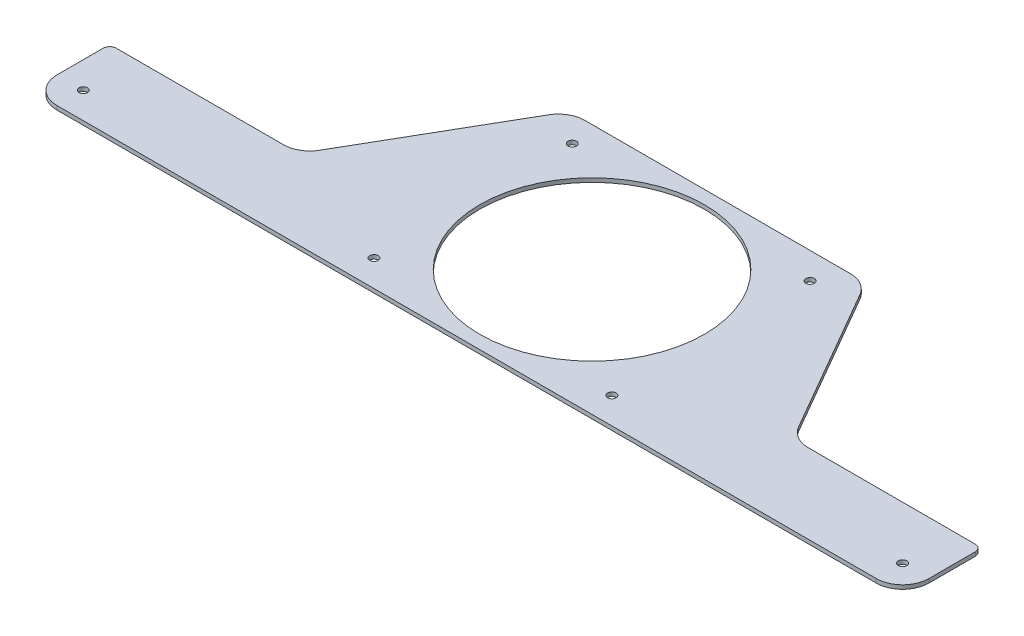
ISO-10303-21;
HEADER;
FILE_DESCRIPTION(('STEP AP214'),'2;1');
FILE_NAME('part.step','',(''),(''),'','','');
FILE_SCHEMA(('AUTOMOTIVE_DESIGN { 1 0 10303 214 1 1 1 1 }'));
ENDSEC;
DATA;
#1=APPLICATION_CONTEXT('core data for automotive mechanical design processes');
#2=APPLICATION_PROTOCOL_DEFINITION('international standard','automotive_design',2000,#1);
#3=PRODUCT_CONTEXT('',#1,'mechanical');
#4=PRODUCT('Part','Part','',(#3));
#5=PRODUCT_RELATED_PRODUCT_CATEGORY('part','',(#4));
#6=PRODUCT_DEFINITION_FORMATION('','',#4);
#7=PRODUCT_DEFINITION_CONTEXT('part definition',#1,'design');
#8=PRODUCT_DEFINITION('design','',#6,#7);
#9=PRODUCT_DEFINITION_SHAPE('','',#8);
#10=(LENGTH_UNIT() NAMED_UNIT(*) SI_UNIT(.MILLI.,.METRE.));
#11=(NAMED_UNIT(*) PLANE_ANGLE_UNIT() SI_UNIT($,.RADIAN.));
#12=(NAMED_UNIT(*) SI_UNIT($,.STERADIAN.) SOLID_ANGLE_UNIT());
#13=UNCERTAINTY_MEASURE_WITH_UNIT(LENGTH_MEASURE(1.E-05),#10,'distance_accuracy_value','');
#14=(GEOMETRIC_REPRESENTATION_CONTEXT(3) GLOBAL_UNCERTAINTY_ASSIGNED_CONTEXT((#13)) GLOBAL_UNIT_ASSIGNED_CONTEXT((#10,
#11,#12)) REPRESENTATION_CONTEXT('',''));
#15=CARTESIAN_POINT('',(0.,0.,0.));
#16=DIRECTION('',(0.,0.,1.));
#17=DIRECTION('',(1.,0.,0.));
#18=AXIS2_PLACEMENT_3D('',#15,#16,#17);
#19=CARTESIAN_POINT('',(0.,1.5,0.));
#20=DIRECTION('',(0.,-1.,0.));
#21=DIRECTION('',(0.,0.,-1.));
#22=AXIS2_PLACEMENT_3D('',#19,#20,#21);
#23=PLANE('',#22);
#24=CARTESIAN_POINT('',(-155.,1.5,37.5));
#25=DIRECTION('',(0.,1.,0.));
#26=DIRECTION('',(0.,0.,1.));
#27=AXIS2_PLACEMENT_3D('',#24,#25,#26);
#28=CIRCLE('',#27,1.59999999999999);
#29=CARTESIAN_POINT('',(-155.,1.5,39.1));
#30=VERTEX_POINT('',#29);
#31=EDGE_CURVE('E467',#30,#30,#28,.T.);
#32=ORIENTED_EDGE('',*,*,#31,.F.);
#33=EDGE_LOOP('',(#32));
#34=FACE_BOUND('',#33,.T.);
#35=CARTESIAN_POINT('',(-45.,1.5,37.5));
#36=DIRECTION('',(0.,1.,0.));
#37=DIRECTION('',(0.,0.,1.));
#38=AXIS2_PLACEMENT_3D('',#35,#36,#37);
#39=CIRCLE('',#38,1.6);
#40=CARTESIAN_POINT('',(-45.,1.5,39.1));
#41=VERTEX_POINT('',#40);
#42=EDGE_CURVE('E473',#41,#41,#39,.T.);
#43=ORIENTED_EDGE('',*,*,#42,.F.);
#44=EDGE_LOOP('',(#43));
#45=FACE_BOUND('',#44,.T.);
#46=CARTESIAN_POINT('',(-45.,1.5,-37.5));
#47=DIRECTION('',(0.,1.,0.));
#48=DIRECTION('',(0.,0.,1.));
#49=AXIS2_PLACEMENT_3D('',#46,#47,#48);
#50=CIRCLE('',#49,1.6);
#51=CARTESIAN_POINT('',(-45.,1.5,-35.9));
#52=VERTEX_POINT('',#51);
#53=EDGE_CURVE('E481',#52,#52,#50,.T.);
#54=ORIENTED_EDGE('',*,*,#53,.F.);
#55=EDGE_LOOP('',(#54));
#56=FACE_BOUND('',#55,.T.);
#57=CARTESIAN_POINT('',(45.,1.5,37.5));
#58=DIRECTION('',(0.,1.,0.));
#59=DIRECTION('',(0.,0.,-1.));
#60=AXIS2_PLACEMENT_3D('',#57,#58,#59);
#61=CIRCLE('',#60,1.6);
#62=CARTESIAN_POINT('',(45.,1.5,35.9));
#63=VERTEX_POINT('',#62);
#64=EDGE_CURVE('E487',#63,#63,#61,.T.);
#65=ORIENTED_EDGE('',*,*,#64,.F.);
#66=EDGE_LOOP('',(#65));
#67=FACE_BOUND('',#66,.T.);
#68=CARTESIAN_POINT('',(45.,1.5,-37.5));
#69=DIRECTION('',(0.,1.,0.));
#70=DIRECTION('',(0.,0.,-1.));
#71=AXIS2_PLACEMENT_3D('',#68,#69,#70);
#72=CIRCLE('',#71,1.6);
#73=CARTESIAN_POINT('',(45.,1.5,-39.1));
#74=VERTEX_POINT('',#73);
#75=EDGE_CURVE('E493',#74,#74,#72,.T.);
#76=ORIENTED_EDGE('',*,*,#75,.F.);
#77=EDGE_LOOP('',(#76));
#78=FACE_BOUND('',#77,.T.);
#79=CARTESIAN_POINT('',(155.,1.5,37.5));
#80=DIRECTION('',(0.,1.,0.));
#81=DIRECTION('',(0.,0.,-1.));
#82=AXIS2_PLACEMENT_3D('',#79,#80,#81);
#83=CIRCLE('',#82,1.59999999999999);
#84=CARTESIAN_POINT('',(155.,1.5,35.9));
#85=VERTEX_POINT('',#84);
#86=EDGE_CURVE('E499',#85,#85,#83,.T.);
#87=ORIENTED_EDGE('',*,*,#86,.F.);
#88=EDGE_LOOP('',(#87));
#89=FACE_BOUND('',#88,.T.);
#90=DIRECTION('',(-1.,0.,0.));
#91=VECTOR('',#90,1.);
#92=CARTESIAN_POINT('',(-93.5277674973255,1.5,17.5));
#93=LINE('',#92,#91);
#94=CARTESIAN_POINT('',(-99.3012701892218,1.5,17.5));
#95=VERTEX_POINT('',#94);
#96=CARTESIAN_POINT('',(-162.5,1.5,17.5000000000001));
#97=VERTEX_POINT('',#96);
#98=EDGE_CURVE('E270',#95,#97,#93,.T.);
#99=ORIENTED_EDGE('',*,*,#98,.T.);
#100=CARTESIAN_POINT('',(-162.5,1.5,20.0000000000001));
#101=DIRECTION('',(0.,-1.,0.));
#102=DIRECTION('',(0.,0.,-1.));
#103=AXIS2_PLACEMENT_3D('',#100,#101,#102);
#104=CIRCLE('',#103,2.5);
#105=CARTESIAN_POINT('',(-165.,1.5,20.0000000000001));
#106=VERTEX_POINT('',#105);
#107=EDGE_CURVE('E220',#97,#106,#104,.F.);
#108=ORIENTED_EDGE('',*,*,#107,.T.);
#109=DIRECTION('',(0.,0.,1.));
#110=VECTOR('',#109,1.);
#111=CARTESIAN_POINT('',(-165.,1.5,17.5000000000001));
#112=LINE('',#111,#110);
#113=CARTESIAN_POINT('',(-165.,1.5,37.5));
#114=VERTEX_POINT('',#113);
#115=EDGE_CURVE('E170',#106,#114,#112,.T.);
#116=ORIENTED_EDGE('',*,*,#115,.T.);
#117=CARTESIAN_POINT('',(-155.,1.5,37.5));
#118=DIRECTION('',(0.,-1.,0.));
#119=DIRECTION('',(0.,0.,-1.));
#120=AXIS2_PLACEMENT_3D('',#117,#118,#119);
#121=CIRCLE('',#120,10.);
#122=CARTESIAN_POINT('',(-155.,1.5,47.5));
#123=VERTEX_POINT('',#122);
#124=EDGE_CURVE('E211',#114,#123,#121,.F.);
#125=ORIENTED_EDGE('',*,*,#124,.T.);
#126=DIRECTION('',(1.,0.,0.));
#127=VECTOR('',#126,1.);
#128=CARTESIAN_POINT('',(-165.,1.5,47.5));
#129=LINE('',#128,#127);
#130=CARTESIAN_POINT('',(155.,1.5,47.4999999999999));
#131=VERTEX_POINT('',#130);
#132=EDGE_CURVE('E274',#123,#131,#129,.T.);
#133=ORIENTED_EDGE('',*,*,#132,.T.);
#134=CARTESIAN_POINT('',(155.,1.5,37.4999999999999));
#135=DIRECTION('',(0.,-1.,0.));
#136=DIRECTION('',(0.,0.,-1.));
#137=AXIS2_PLACEMENT_3D('',#134,#135,#136);
#138=CIRCLE('',#137,10.);
#139=CARTESIAN_POINT('',(165.,1.5,37.4999999999999));
#140=VERTEX_POINT('',#139);
#141=EDGE_CURVE('E213',#131,#140,#138,.F.);
#142=ORIENTED_EDGE('',*,*,#141,.T.);
#143=DIRECTION('',(0.,0.,-1.));
#144=VECTOR('',#143,1.);
#145=CARTESIAN_POINT('',(165.,1.5,17.5));
#146=LINE('',#145,#144);
#147=CARTESIAN_POINT('',(165.,1.5,20.));
#148=VERTEX_POINT('',#147);
#149=EDGE_CURVE('E281',#140,#148,#146,.T.);
#150=ORIENTED_EDGE('',*,*,#149,.T.);
#151=CARTESIAN_POINT('',(162.5,1.5,20.));
#152=DIRECTION('',(0.,-1.,0.));
#153=DIRECTION('',(0.,0.,-1.));
#154=AXIS2_PLACEMENT_3D('',#151,#152,#153);
#155=CIRCLE('',#154,2.5);
#156=CARTESIAN_POINT('',(162.5,1.5,17.5));
#157=VERTEX_POINT('',#156);
#158=EDGE_CURVE('E218',#148,#157,#155,.F.);
#159=ORIENTED_EDGE('',*,*,#158,.T.);
#160=DIRECTION('',(-1.,0.,0.));
#161=VECTOR('',#160,1.);
#162=CARTESIAN_POINT('',(93.5277674973255,1.5,17.5));
#163=LINE('',#162,#161);
#164=CARTESIAN_POINT('',(99.3012701892218,1.5,17.5));
#165=VERTEX_POINT('',#164);
#166=EDGE_CURVE('E284',#157,#165,#163,.T.);
#167=ORIENTED_EDGE('',*,*,#166,.T.);
#168=CARTESIAN_POINT('',(99.3012701892218,1.5,7.50000000000001));
#169=DIRECTION('',(0.,-1.,0.));
#170=DIRECTION('',(0.,0.,-1.));
#171=AXIS2_PLACEMENT_3D('',#168,#169,#170);
#172=CIRCLE('',#171,10.);
#173=CARTESIAN_POINT('',(90.6410161513773,1.5,12.5));
#174=VERTEX_POINT('',#173);
#175=EDGE_CURVE('E253',#165,#174,#172,.T.);
#176=ORIENTED_EDGE('',*,*,#175,.T.);
#177=DIRECTION('',(-0.499999999999998,0.,-0.86602540378444));
#178=VECTOR('',#177,1.);
#179=CARTESIAN_POINT('',(56.,1.5,-47.5));
#180=LINE('',#179,#178);
#181=CARTESIAN_POINT('',(58.8867513459481,1.5,-42.5));
#182=VERTEX_POINT('',#181);
#183=EDGE_CURVE('E287',#174,#182,#180,.T.);
#184=ORIENTED_EDGE('',*,*,#183,.T.);
#185=CARTESIAN_POINT('',(50.2264973081037,1.5,-37.5));
#186=DIRECTION('',(0.,-1.,0.));
#187=DIRECTION('',(0.,0.,-1.));
#188=AXIS2_PLACEMENT_3D('',#185,#186,#187);
#189=CIRCLE('',#188,10.);
#190=CARTESIAN_POINT('',(50.2264973081037,1.5,-47.5));
#191=VERTEX_POINT('',#190);
#192=EDGE_CURVE('E58',#182,#191,#189,.F.);
#193=ORIENTED_EDGE('',*,*,#192,.T.);
#194=DIRECTION('',(-1.,0.,0.));
#195=VECTOR('',#194,1.);
#196=CARTESIAN_POINT('',(56.,1.5,-47.5));
#197=LINE('',#196,#195);
#198=CARTESIAN_POINT('',(-50.2264973081037,1.5,-47.4999999999999));
#199=VERTEX_POINT('',#198);
#200=EDGE_CURVE('E198',#191,#199,#197,.T.);
#201=ORIENTED_EDGE('',*,*,#200,.T.);
#202=CARTESIAN_POINT('',(-50.2264973081037,1.5,-37.4999999999999));
#203=DIRECTION('',(0.,-1.,0.));
#204=DIRECTION('',(0.,0.,-1.));
#205=AXIS2_PLACEMENT_3D('',#202,#203,#204);
#206=CIRCLE('',#205,10.);
#207=CARTESIAN_POINT('',(-58.8867513459481,1.5,-42.4999999999999));
#208=VERTEX_POINT('',#207);
#209=EDGE_CURVE('E215',#199,#208,#206,.F.);
#210=ORIENTED_EDGE('',*,*,#209,.T.);
#211=DIRECTION('',(-0.499999999999998,0.,0.86602540378444));
#212=VECTOR('',#211,1.);
#213=CARTESIAN_POINT('',(-56.,1.5,-47.4999999999999));
#214=LINE('',#213,#212);
#215=CARTESIAN_POINT('',(-90.6410161513773,1.5,12.5));
#216=VERTEX_POINT('',#215);
#217=EDGE_CURVE('E197',#208,#216,#214,.T.);
#218=ORIENTED_EDGE('',*,*,#217,.T.);
#219=CARTESIAN_POINT('',(-99.3012701892218,1.5,7.50000000000005));
#220=DIRECTION('',(0.,-1.,0.));
#221=DIRECTION('',(0.,0.,-1.));
#222=AXIS2_PLACEMENT_3D('',#219,#220,#221);
#223=CIRCLE('',#222,10.);
#224=EDGE_CURVE('E12',#216,#95,#223,.T.);
#225=ORIENTED_EDGE('',*,*,#224,.T.);
#226=EDGE_LOOP('',(#99,#108,#116,#125,#133,#142,#150,#159,#167,#176,#184,#193,#201,#210,#218,#225));
#227=FACE_BOUND('',#226,.T.);
#228=CARTESIAN_POINT('',(0.,1.5,0.));
#229=DIRECTION('',(0.,1.,0.));
#230=DIRECTION('',(0.,0.,1.));
#231=AXIS2_PLACEMENT_3D('',#228,#229,#230);
#232=CIRCLE('',#231,42.5);
#233=CARTESIAN_POINT('',(0.,1.5,42.5));
#234=VERTEX_POINT('',#233);
#235=EDGE_CURVE('E264',#234,#234,#232,.T.);
#236=ORIENTED_EDGE('',*,*,#235,.F.);
#237=EDGE_LOOP('',(#236));
#238=FACE_BOUND('',#237,.T.);
#239=ADVANCED_FACE('F36',(#34,#45,#56,#67,#78,#89,#227,#238),#23,.F.);
#240=CARTESIAN_POINT('',(0.,0.,0.));
#241=DIRECTION('',(0.,-1.,0.));
#242=DIRECTION('',(0.,0.,-1.));
#243=AXIS2_PLACEMENT_3D('',#240,#241,#242);
#244=PLANE('',#243);
#245=CARTESIAN_POINT('',(-155.,0.,37.5));
#246=DIRECTION('',(0.,1.,0.));
#247=DIRECTION('',(0.,0.,1.));
#248=AXIS2_PLACEMENT_3D('',#245,#246,#247);
#249=CIRCLE('',#248,1.59999999999999);
#250=CARTESIAN_POINT('',(-155.,0.,39.1));
#251=VERTEX_POINT('',#250);
#252=EDGE_CURVE('E465',#251,#251,#249,.T.);
#253=ORIENTED_EDGE('',*,*,#252,.T.);
#254=EDGE_LOOP('',(#253));
#255=FACE_BOUND('',#254,.T.);
#256=CARTESIAN_POINT('',(-45.,0.,37.5));
#257=DIRECTION('',(0.,1.,0.));
#258=DIRECTION('',(0.,0.,1.));
#259=AXIS2_PLACEMENT_3D('',#256,#257,#258);
#260=CIRCLE('',#259,1.6);
#261=CARTESIAN_POINT('',(-45.,0.,39.1));
#262=VERTEX_POINT('',#261);
#263=EDGE_CURVE('E468',#262,#262,#260,.T.);
#264=ORIENTED_EDGE('',*,*,#263,.T.);
#265=EDGE_LOOP('',(#264));
#266=FACE_BOUND('',#265,.T.);
#267=CARTESIAN_POINT('',(-45.,0.,-37.5));
#268=DIRECTION('',(0.,1.,0.));
#269=DIRECTION('',(0.,0.,1.));
#270=AXIS2_PLACEMENT_3D('',#267,#268,#269);
#271=CIRCLE('',#270,1.6);
#272=CARTESIAN_POINT('',(-45.,0.,-35.9));
#273=VERTEX_POINT('',#272);
#274=EDGE_CURVE('E478',#273,#273,#271,.T.);
#275=ORIENTED_EDGE('',*,*,#274,.T.);
#276=EDGE_LOOP('',(#275));
#277=FACE_BOUND('',#276,.T.);
#278=CARTESIAN_POINT('',(45.,0.,37.5));
#279=DIRECTION('',(0.,1.,0.));
#280=DIRECTION('',(0.,0.,-1.));
#281=AXIS2_PLACEMENT_3D('',#278,#279,#280);
#282=CIRCLE('',#281,1.6);
#283=CARTESIAN_POINT('',(45.,0.,35.9));
#284=VERTEX_POINT('',#283);
#285=EDGE_CURVE('E484',#284,#284,#282,.T.);
#286=ORIENTED_EDGE('',*,*,#285,.T.);
#287=EDGE_LOOP('',(#286));
#288=FACE_BOUND('',#287,.T.);
#289=CARTESIAN_POINT('',(45.,0.,-37.5));
#290=DIRECTION('',(0.,1.,0.));
#291=DIRECTION('',(0.,0.,-1.));
#292=AXIS2_PLACEMENT_3D('',#289,#290,#291);
#293=CIRCLE('',#292,1.6);
#294=CARTESIAN_POINT('',(45.,0.,-39.1));
#295=VERTEX_POINT('',#294);
#296=EDGE_CURVE('E490',#295,#295,#293,.T.);
#297=ORIENTED_EDGE('',*,*,#296,.T.);
#298=EDGE_LOOP('',(#297));
#299=FACE_BOUND('',#298,.T.);
#300=CARTESIAN_POINT('',(155.,0.,37.5));
#301=DIRECTION('',(0.,1.,0.));
#302=DIRECTION('',(0.,0.,-1.));
#303=AXIS2_PLACEMENT_3D('',#300,#301,#302);
#304=CIRCLE('',#303,1.59999999999999);
#305=CARTESIAN_POINT('',(155.,0.,35.9));
#306=VERTEX_POINT('',#305);
#307=EDGE_CURVE('E496',#306,#306,#304,.T.);
#308=ORIENTED_EDGE('',*,*,#307,.T.);
#309=EDGE_LOOP('',(#308));
#310=FACE_BOUND('',#309,.T.);
#311=DIRECTION('',(0.,0.,1.));
#312=VECTOR('',#311,1.);
#313=CARTESIAN_POINT('',(-165.,0.,17.5000000000001));
#314=LINE('',#313,#312);
#315=CARTESIAN_POINT('',(-165.,0.,20.0000000000001));
#316=VERTEX_POINT('',#315);
#317=CARTESIAN_POINT('',(-165.,0.,37.5));
#318=VERTEX_POINT('',#317);
#319=EDGE_CURVE('E167',#316,#318,#314,.T.);
#320=ORIENTED_EDGE('',*,*,#319,.F.);
#321=CARTESIAN_POINT('',(-162.5,0.,20.0000000000001));
#322=DIRECTION('',(0.,-1.,0.));
#323=DIRECTION('',(0.,0.,-1.));
#324=AXIS2_PLACEMENT_3D('',#321,#322,#323);
#325=CIRCLE('',#324,2.5);
#326=CARTESIAN_POINT('',(-162.5,0.,17.5000000000001));
#327=VERTEX_POINT('',#326);
#328=EDGE_CURVE('E150',#316,#327,#325,.T.);
#329=ORIENTED_EDGE('',*,*,#328,.T.);
#330=DIRECTION('',(-1.,0.,0.));
#331=VECTOR('',#330,1.);
#332=CARTESIAN_POINT('',(-93.5277674973255,0.,17.5));
#333=LINE('',#332,#331);
#334=CARTESIAN_POINT('',(-99.3012701892218,0.,17.5));
#335=VERTEX_POINT('',#334);
#336=EDGE_CURVE('E178',#335,#327,#333,.T.);
#337=ORIENTED_EDGE('',*,*,#336,.F.);
#338=CARTESIAN_POINT('',(-99.3012701892218,0.,7.50000000000005));
#339=DIRECTION('',(0.,-1.,0.));
#340=DIRECTION('',(0.,0.,-1.));
#341=AXIS2_PLACEMENT_3D('',#338,#339,#340);
#342=CIRCLE('',#341,10.);
#343=CARTESIAN_POINT('',(-90.6410161513773,0.,12.5));
#344=VERTEX_POINT('',#343);
#345=EDGE_CURVE('E44',#335,#344,#342,.F.);
#346=ORIENTED_EDGE('',*,*,#345,.T.);
#347=DIRECTION('',(-0.499999999999998,0.,0.86602540378444));
#348=VECTOR('',#347,1.);
#349=CARTESIAN_POINT('',(-56.,0.,-47.4999999999999));
#350=LINE('',#349,#348);
#351=CARTESIAN_POINT('',(-58.8867513459481,0.,-42.4999999999999));
#352=VERTEX_POINT('',#351);
#353=EDGE_CURVE('E183',#352,#344,#350,.T.);
#354=ORIENTED_EDGE('',*,*,#353,.F.);
#355=CARTESIAN_POINT('',(-50.2264973081037,0.,-37.4999999999999));
#356=DIRECTION('',(0.,-1.,0.));
#357=DIRECTION('',(0.,0.,-1.));
#358=AXIS2_PLACEMENT_3D('',#355,#356,#357);
#359=CIRCLE('',#358,10.);
#360=CARTESIAN_POINT('',(-50.2264973081037,0.,-47.4999999999999));
#361=VERTEX_POINT('',#360);
#362=EDGE_CURVE('E203',#352,#361,#359,.T.);
#363=ORIENTED_EDGE('',*,*,#362,.T.);
#364=DIRECTION('',(-1.,0.,0.));
#365=VECTOR('',#364,1.);
#366=CARTESIAN_POINT('',(56.,0.,-47.5));
#367=LINE('',#366,#365);
#368=CARTESIAN_POINT('',(50.2264973081037,0.,-47.5));
#369=VERTEX_POINT('',#368);
#370=EDGE_CURVE('E195',#369,#361,#367,.T.);
#371=ORIENTED_EDGE('',*,*,#370,.F.);
#372=CARTESIAN_POINT('',(50.2264973081037,0.,-37.5));
#373=DIRECTION('',(0.,-1.,0.));
#374=DIRECTION('',(0.,0.,-1.));
#375=AXIS2_PLACEMENT_3D('',#372,#373,#374);
#376=CIRCLE('',#375,10.);
#377=CARTESIAN_POINT('',(58.8867513459481,0.,-42.5));
#378=VERTEX_POINT('',#377);
#379=EDGE_CURVE('E205',#369,#378,#376,.T.);
#380=ORIENTED_EDGE('',*,*,#379,.T.);
#381=DIRECTION('',(-0.499999999999998,0.,-0.86602540378444));
#382=VECTOR('',#381,1.);
#383=CARTESIAN_POINT('',(56.,0.,-47.5));
#384=LINE('',#383,#382);
#385=CARTESIAN_POINT('',(90.6410161513773,0.,12.5));
#386=VERTEX_POINT('',#385);
#387=EDGE_CURVE('E192',#386,#378,#384,.T.);
#388=ORIENTED_EDGE('',*,*,#387,.F.);
#389=CARTESIAN_POINT('',(99.3012701892218,0.,7.50000000000001));
#390=DIRECTION('',(0.,-1.,0.));
#391=DIRECTION('',(0.,0.,-1.));
#392=AXIS2_PLACEMENT_3D('',#389,#390,#391);
#393=CIRCLE('',#392,10.);
#394=CARTESIAN_POINT('',(99.3012701892218,0.,17.5));
#395=VERTEX_POINT('',#394);
#396=EDGE_CURVE('E251',#386,#395,#393,.F.);
#397=ORIENTED_EDGE('',*,*,#396,.T.);
#398=DIRECTION('',(-1.,0.,0.));
#399=VECTOR('',#398,1.);
#400=CARTESIAN_POINT('',(93.5277674973255,0.,17.5));
#401=LINE('',#400,#399);
#402=CARTESIAN_POINT('',(162.5,0.,17.5));
#403=VERTEX_POINT('',#402);
#404=EDGE_CURVE('E189',#403,#395,#401,.T.);
#405=ORIENTED_EDGE('',*,*,#404,.F.);
#406=CARTESIAN_POINT('',(162.5,0.,20.));
#407=DIRECTION('',(0.,-1.,0.));
#408=DIRECTION('',(0.,0.,-1.));
#409=AXIS2_PLACEMENT_3D('',#406,#407,#408);
#410=CIRCLE('',#409,2.5);
#411=CARTESIAN_POINT('',(165.,0.,20.));
#412=VERTEX_POINT('',#411);
#413=EDGE_CURVE('E161',#403,#412,#410,.T.);
#414=ORIENTED_EDGE('',*,*,#413,.T.);
#415=DIRECTION('',(0.,0.,-1.));
#416=VECTOR('',#415,1.);
#417=CARTESIAN_POINT('',(165.,0.,17.5));
#418=LINE('',#417,#416);
#419=CARTESIAN_POINT('',(165.,0.,37.4999999999999));
#420=VERTEX_POINT('',#419);
#421=EDGE_CURVE('E181',#420,#412,#418,.T.);
#422=ORIENTED_EDGE('',*,*,#421,.F.);
#423=CARTESIAN_POINT('',(155.,0.,37.4999999999999));
#424=DIRECTION('',(0.,-1.,0.));
#425=DIRECTION('',(0.,0.,-1.));
#426=AXIS2_PLACEMENT_3D('',#423,#424,#425);
#427=CIRCLE('',#426,10.);
#428=CARTESIAN_POINT('',(155.,0.,47.4999999999999));
#429=VERTEX_POINT('',#428);
#430=EDGE_CURVE('E201',#420,#429,#427,.T.);
#431=ORIENTED_EDGE('',*,*,#430,.T.);
#432=DIRECTION('',(1.,0.,0.));
#433=VECTOR('',#432,1.);
#434=CARTESIAN_POINT('',(-165.,0.,47.5));
#435=LINE('',#434,#433);
#436=CARTESIAN_POINT('',(-155.,0.,47.5));
#437=VERTEX_POINT('',#436);
#438=EDGE_CURVE('E177',#437,#429,#435,.T.);
#439=ORIENTED_EDGE('',*,*,#438,.F.);
#440=CARTESIAN_POINT('',(-155.,0.,37.5));
#441=DIRECTION('',(0.,-1.,0.));
#442=DIRECTION('',(0.,0.,-1.));
#443=AXIS2_PLACEMENT_3D('',#440,#441,#442);
#444=CIRCLE('',#443,10.);
#445=EDGE_CURVE('E171',#437,#318,#444,.T.);
#446=ORIENTED_EDGE('',*,*,#445,.T.);
#447=EDGE_LOOP('',(#320,#329,#337,#346,#354,#363,#371,#380,#388,#397,#405,#414,#422,#431,#439,#446));
#448=FACE_BOUND('',#447,.T.);
#449=CARTESIAN_POINT('',(0.,0.,0.));
#450=DIRECTION('',(0.,1.,0.));
#451=DIRECTION('',(0.,0.,1.));
#452=AXIS2_PLACEMENT_3D('',#449,#450,#451);
#453=CIRCLE('',#452,42.5);
#454=CARTESIAN_POINT('',(0.,0.,42.5));
#455=VERTEX_POINT('',#454);
#456=EDGE_CURVE('E470',#455,#455,#453,.T.);
#457=ORIENTED_EDGE('',*,*,#456,.T.);
#458=EDGE_LOOP('',(#457));
#459=FACE_BOUND('',#458,.T.);
#460=ADVANCED_FACE('F174',(#255,#266,#277,#288,#299,#310,#448,#459),#244,.T.);
#461=CARTESIAN_POINT('',(-56.,1.5,-47.4999999999999));
#462=DIRECTION('',(0.86602540378444,0.,0.499999999999998));
#463=DIRECTION('',(0.499999999999998,0.,-0.86602540378444));
#464=AXIS2_PLACEMENT_3D('',#461,#462,#463);
#465=PLANE('',#464);
#466=ORIENTED_EDGE('',*,*,#217,.F.);
#467=DIRECTION('',(0.,-1.,0.));
#468=VECTOR('',#467,1.);
#469=CARTESIAN_POINT('',(-58.8867513459481,1.5,-42.4999999999999));
#470=LINE('',#469,#468);
#471=EDGE_CURVE('E243',#208,#352,#470,.T.);
#472=ORIENTED_EDGE('',*,*,#471,.T.);
#473=ORIENTED_EDGE('',*,*,#353,.T.);
#474=DIRECTION('',(0.,-1.,0.));
#475=VECTOR('',#474,1.);
#476=CARTESIAN_POINT('',(-90.6410161513773,1.5,12.5));
#477=LINE('',#476,#475);
#478=EDGE_CURVE('E241',#344,#216,#477,.F.);
#479=ORIENTED_EDGE('',*,*,#478,.T.);
#480=EDGE_LOOP('',(#466,#472,#473,#479));
#481=FACE_BOUND('',#480,.T.);
#482=ADVANCED_FACE('F261',(#481),#465,.F.);
#483=CARTESIAN_POINT('',(-93.5277674973255,1.5,17.5));
#484=DIRECTION('',(0.,0.,1.));
#485=DIRECTION('',(1.,0.,0.));
#486=AXIS2_PLACEMENT_3D('',#483,#484,#485);
#487=PLANE('',#486);
#488=ORIENTED_EDGE('',*,*,#336,.T.);
#489=DIRECTION('',(0.,-1.,0.));
#490=VECTOR('',#489,1.);
#491=CARTESIAN_POINT('',(-162.5,1.5,17.5000000000001));
#492=LINE('',#491,#490);
#493=EDGE_CURVE('E155',#327,#97,#492,.F.);
#494=ORIENTED_EDGE('',*,*,#493,.T.);
#495=ORIENTED_EDGE('',*,*,#98,.F.);
#496=DIRECTION('',(0.,-1.,0.));
#497=VECTOR('',#496,1.);
#498=CARTESIAN_POINT('',(-99.3012701892218,0.,17.5));
#499=LINE('',#498,#497);
#500=EDGE_CURVE('E160',#95,#335,#499,.T.);
#501=ORIENTED_EDGE('',*,*,#500,.T.);
#502=EDGE_LOOP('',(#488,#494,#495,#501));
#503=FACE_BOUND('',#502,.T.);
#504=ADVANCED_FACE('F272',(#503),#487,.F.);
#505=CARTESIAN_POINT('',(-165.,1.5,17.5000000000001));
#506=DIRECTION('',(1.,0.,0.));
#507=DIRECTION('',(0.,0.,-1.));
#508=AXIS2_PLACEMENT_3D('',#505,#506,#507);
#509=PLANE('',#508);
#510=ORIENTED_EDGE('',*,*,#115,.F.);
#511=DIRECTION('',(0.,-1.,0.));
#512=VECTOR('',#511,1.);
#513=CARTESIAN_POINT('',(-165.,1.5,20.0000000000001));
#514=LINE('',#513,#512);
#515=EDGE_CURVE('E154',#106,#316,#514,.T.);
#516=ORIENTED_EDGE('',*,*,#515,.T.);
#517=ORIENTED_EDGE('',*,*,#319,.T.);
#518=DIRECTION('',(0.,-1.,0.));
#519=VECTOR('',#518,1.);
#520=CARTESIAN_POINT('',(-165.,1.5,37.5));
#521=LINE('',#520,#519);
#522=EDGE_CURVE('E172',#318,#114,#521,.F.);
#523=ORIENTED_EDGE('',*,*,#522,.T.);
#524=EDGE_LOOP('',(#510,#516,#517,#523));
#525=FACE_BOUND('',#524,.T.);
#526=ADVANCED_FACE('F166',(#525),#509,.F.);
#527=CARTESIAN_POINT('',(-165.,1.5,47.5));
#528=DIRECTION('',(0.,0.,-1.));
#529=DIRECTION('',(-1.,0.,0.));
#530=AXIS2_PLACEMENT_3D('',#527,#528,#529);
#531=PLANE('',#530);
#532=ORIENTED_EDGE('',*,*,#438,.T.);
#533=DIRECTION('',(0.,-1.,0.));
#534=VECTOR('',#533,1.);
#535=CARTESIAN_POINT('',(155.,1.5,47.4999999999999));
#536=LINE('',#535,#534);
#537=EDGE_CURVE('E249',#429,#131,#536,.F.);
#538=ORIENTED_EDGE('',*,*,#537,.T.);
#539=ORIENTED_EDGE('',*,*,#132,.F.);
#540=DIRECTION('',(0.,-1.,0.));
#541=VECTOR('',#540,1.);
#542=CARTESIAN_POINT('',(-155.,1.5,47.5));
#543=LINE('',#542,#541);
#544=EDGE_CURVE('E246',#123,#437,#543,.T.);
#545=ORIENTED_EDGE('',*,*,#544,.T.);
#546=EDGE_LOOP('',(#532,#538,#539,#545));
#547=FACE_BOUND('',#546,.T.);
#548=ADVANCED_FACE('F326',(#547),#531,.F.);
#549=CARTESIAN_POINT('',(165.,1.5,17.5));
#550=DIRECTION('',(-1.,0.,0.));
#551=DIRECTION('',(0.,0.,1.));
#552=AXIS2_PLACEMENT_3D('',#549,#550,#551);
#553=PLANE('',#552);
#554=ORIENTED_EDGE('',*,*,#421,.T.);
#555=DIRECTION('',(0.,-1.,0.));
#556=VECTOR('',#555,1.);
#557=CARTESIAN_POINT('',(165.,1.5,20.));
#558=LINE('',#557,#556);
#559=EDGE_CURVE('E230',#412,#148,#558,.F.);
#560=ORIENTED_EDGE('',*,*,#559,.T.);
#561=ORIENTED_EDGE('',*,*,#149,.F.);
#562=DIRECTION('',(0.,-1.,0.));
#563=VECTOR('',#562,1.);
#564=CARTESIAN_POINT('',(165.,1.5,37.4999999999999));
#565=LINE('',#564,#563);
#566=EDGE_CURVE('E227',#140,#420,#565,.T.);
#567=ORIENTED_EDGE('',*,*,#566,.T.);
#568=EDGE_LOOP('',(#554,#560,#561,#567));
#569=FACE_BOUND('',#568,.T.);
#570=ADVANCED_FACE('F318',(#569),#553,.F.);
#571=CARTESIAN_POINT('',(93.5277674973255,1.5,17.5));
#572=DIRECTION('',(0.,0.,1.));
#573=DIRECTION('',(1.,0.,0.));
#574=AXIS2_PLACEMENT_3D('',#571,#572,#573);
#575=PLANE('',#574);
#576=ORIENTED_EDGE('',*,*,#166,.F.);
#577=DIRECTION('',(0.,-1.,0.));
#578=VECTOR('',#577,1.);
#579=CARTESIAN_POINT('',(162.5,1.5,17.5));
#580=LINE('',#579,#578);
#581=EDGE_CURVE('E224',#157,#403,#580,.T.);
#582=ORIENTED_EDGE('',*,*,#581,.T.);
#583=ORIENTED_EDGE('',*,*,#404,.T.);
#584=DIRECTION('',(0.,-1.,0.));
#585=VECTOR('',#584,1.);
#586=CARTESIAN_POINT('',(99.3012701892218,1.5,17.5));
#587=LINE('',#586,#585);
#588=EDGE_CURVE('E222',#395,#165,#587,.F.);
#589=ORIENTED_EDGE('',*,*,#588,.T.);
#590=EDGE_LOOP('',(#576,#582,#583,#589));
#591=FACE_BOUND('',#590,.T.);
#592=ADVANCED_FACE('F310',(#591),#575,.F.);
#593=CARTESIAN_POINT('',(56.,1.5,-47.5));
#594=DIRECTION('',(-0.86602540378444,0.,0.499999999999998));
#595=DIRECTION('',(0.499999999999998,0.,0.86602540378444));
#596=AXIS2_PLACEMENT_3D('',#593,#594,#595);
#597=PLANE('',#596);
#598=ORIENTED_EDGE('',*,*,#183,.F.);
#599=DIRECTION('',(0.,-1.,0.));
#600=VECTOR('',#599,1.);
#601=CARTESIAN_POINT('',(90.6410161513773,0.,12.5));
#602=LINE('',#601,#600);
#603=EDGE_CURVE('E234',#174,#386,#602,.T.);
#604=ORIENTED_EDGE('',*,*,#603,.T.);
#605=ORIENTED_EDGE('',*,*,#387,.T.);
#606=DIRECTION('',(0.,-1.,0.));
#607=VECTOR('',#606,1.);
#608=CARTESIAN_POINT('',(58.8867513459481,1.5,-42.5));
#609=LINE('',#608,#607);
#610=EDGE_CURVE('E232',#378,#182,#609,.F.);
#611=ORIENTED_EDGE('',*,*,#610,.T.);
#612=EDGE_LOOP('',(#598,#604,#605,#611));
#613=FACE_BOUND('',#612,.T.);
#614=ADVANCED_FACE('F301',(#613),#597,.F.);
#615=CARTESIAN_POINT('',(56.,1.5,-47.5));
#616=DIRECTION('',(0.,0.,1.));
#617=DIRECTION('',(1.,0.,0.));
#618=AXIS2_PLACEMENT_3D('',#615,#616,#617);
#619=PLANE('',#618);
#620=ORIENTED_EDGE('',*,*,#200,.F.);
#621=DIRECTION('',(0.,-1.,0.));
#622=VECTOR('',#621,1.);
#623=CARTESIAN_POINT('',(50.2264973081037,1.5,-47.5));
#624=LINE('',#623,#622);
#625=EDGE_CURVE('E238',#191,#369,#624,.T.);
#626=ORIENTED_EDGE('',*,*,#625,.T.);
#627=ORIENTED_EDGE('',*,*,#370,.T.);
#628=DIRECTION('',(0.,-1.,0.));
#629=VECTOR('',#628,1.);
#630=CARTESIAN_POINT('',(-50.2264973081037,1.5,-47.4999999999999));
#631=LINE('',#630,#629);
#632=EDGE_CURVE('E51',#361,#199,#631,.F.);
#633=ORIENTED_EDGE('',*,*,#632,.T.);
#634=EDGE_LOOP('',(#620,#626,#627,#633));
#635=FACE_BOUND('',#634,.T.);
#636=ADVANCED_FACE('F294',(#635),#619,.F.);
#637=CARTESIAN_POINT('',(0.,1.5,0.));
#638=DIRECTION('',(0.,-1.,0.));
#639=DIRECTION('',(0.,0.,-1.));
#640=AXIS2_PLACEMENT_3D('',#637,#638,#639);
#641=CYLINDRICAL_SURFACE('',#640,42.5);
#642=ORIENTED_EDGE('',*,*,#235,.T.);
#643=EDGE_LOOP('',(#642));
#644=FACE_BOUND('',#643,.T.);
#645=ORIENTED_EDGE('',*,*,#456,.F.);
#646=EDGE_LOOP('',(#645));
#647=FACE_BOUND('',#646,.T.);
#648=ADVANCED_FACE('F351',(#644,#647),#641,.F.);
#649=CARTESIAN_POINT('',(-162.5,1.5,20.0000000000001));
#650=DIRECTION('',(0.,-1.,0.));
#651=DIRECTION('',(0.,0.,-1.));
#652=AXIS2_PLACEMENT_3D('',#649,#650,#651);
#653=CYLINDRICAL_SURFACE('',#652,2.5);
#654=ORIENTED_EDGE('',*,*,#107,.F.);
#655=ORIENTED_EDGE('',*,*,#493,.F.);
#656=ORIENTED_EDGE('',*,*,#328,.F.);
#657=ORIENTED_EDGE('',*,*,#515,.F.);
#658=EDGE_LOOP('',(#654,#655,#656,#657));
#659=FACE_BOUND('',#658,.T.);
#660=ADVANCED_FACE('F153',(#659),#653,.T.);
#661=CARTESIAN_POINT('',(162.5,1.5,20.));
#662=DIRECTION('',(0.,-1.,0.));
#663=DIRECTION('',(0.,0.,-1.));
#664=AXIS2_PLACEMENT_3D('',#661,#662,#663);
#665=CYLINDRICAL_SURFACE('',#664,2.5);
#666=ORIENTED_EDGE('',*,*,#158,.F.);
#667=ORIENTED_EDGE('',*,*,#559,.F.);
#668=ORIENTED_EDGE('',*,*,#413,.F.);
#669=ORIENTED_EDGE('',*,*,#581,.F.);
#670=EDGE_LOOP('',(#666,#667,#668,#669));
#671=FACE_BOUND('',#670,.T.);
#672=ADVANCED_FACE('F314',(#671),#665,.T.);
#673=CARTESIAN_POINT('',(99.3012701892218,1.5,7.50000000000001));
#674=DIRECTION('',(0.,1.,0.));
#675=DIRECTION('',(0.,0.,1.));
#676=AXIS2_PLACEMENT_3D('',#673,#674,#675);
#677=CYLINDRICAL_SURFACE('',#676,10.);
#678=ORIENTED_EDGE('',*,*,#175,.F.);
#679=ORIENTED_EDGE('',*,*,#588,.F.);
#680=ORIENTED_EDGE('',*,*,#396,.F.);
#681=ORIENTED_EDGE('',*,*,#603,.F.);
#682=EDGE_LOOP('',(#678,#679,#680,#681));
#683=FACE_BOUND('',#682,.T.);
#684=ADVANCED_FACE('F305',(#683),#677,.F.);
#685=CARTESIAN_POINT('',(50.2264973081037,1.5,-37.5));
#686=DIRECTION('',(0.,-1.,0.));
#687=DIRECTION('',(0.,0.,-1.));
#688=AXIS2_PLACEMENT_3D('',#685,#686,#687);
#689=CYLINDRICAL_SURFACE('',#688,10.);
#690=ORIENTED_EDGE('',*,*,#192,.F.);
#691=ORIENTED_EDGE('',*,*,#610,.F.);
#692=ORIENTED_EDGE('',*,*,#379,.F.);
#693=ORIENTED_EDGE('',*,*,#625,.F.);
#694=EDGE_LOOP('',(#690,#691,#692,#693));
#695=FACE_BOUND('',#694,.T.);
#696=ADVANCED_FACE('F296',(#695),#689,.T.);
#697=CARTESIAN_POINT('',(-50.2264973081037,1.5,-37.4999999999999));
#698=DIRECTION('',(0.,-1.,0.));
#699=DIRECTION('',(0.,0.,-1.));
#700=AXIS2_PLACEMENT_3D('',#697,#698,#699);
#701=CYLINDRICAL_SURFACE('',#700,10.);
#702=ORIENTED_EDGE('',*,*,#209,.F.);
#703=ORIENTED_EDGE('',*,*,#632,.F.);
#704=ORIENTED_EDGE('',*,*,#362,.F.);
#705=ORIENTED_EDGE('',*,*,#471,.F.);
#706=EDGE_LOOP('',(#702,#703,#704,#705));
#707=FACE_BOUND('',#706,.T.);
#708=ADVANCED_FACE('F292',(#707),#701,.T.);
#709=CARTESIAN_POINT('',(-99.3012701892218,1.5,7.50000000000005));
#710=DIRECTION('',(0.,1.,0.));
#711=DIRECTION('',(0.,0.,1.));
#712=AXIS2_PLACEMENT_3D('',#709,#710,#711);
#713=CYLINDRICAL_SURFACE('',#712,10.);
#714=ORIENTED_EDGE('',*,*,#224,.F.);
#715=ORIENTED_EDGE('',*,*,#478,.F.);
#716=ORIENTED_EDGE('',*,*,#345,.F.);
#717=ORIENTED_EDGE('',*,*,#500,.F.);
#718=EDGE_LOOP('',(#714,#715,#716,#717));
#719=FACE_BOUND('',#718,.T.);
#720=ADVANCED_FACE('F266',(#719),#713,.F.);
#721=CARTESIAN_POINT('',(155.,1.5,37.4999999999999));
#722=DIRECTION('',(0.,-1.,0.));
#723=DIRECTION('',(0.,0.,-1.));
#724=AXIS2_PLACEMENT_3D('',#721,#722,#723);
#725=CYLINDRICAL_SURFACE('',#724,10.);
#726=ORIENTED_EDGE('',*,*,#141,.F.);
#727=ORIENTED_EDGE('',*,*,#537,.F.);
#728=ORIENTED_EDGE('',*,*,#430,.F.);
#729=ORIENTED_EDGE('',*,*,#566,.F.);
#730=EDGE_LOOP('',(#726,#727,#728,#729));
#731=FACE_BOUND('',#730,.T.);
#732=ADVANCED_FACE('F323',(#731),#725,.T.);
#733=CARTESIAN_POINT('',(-155.,1.5,37.5));
#734=DIRECTION('',(0.,-1.,0.));
#735=DIRECTION('',(0.,0.,-1.));
#736=AXIS2_PLACEMENT_3D('',#733,#734,#735);
#737=CYLINDRICAL_SURFACE('',#736,10.);
#738=ORIENTED_EDGE('',*,*,#124,.F.);
#739=ORIENTED_EDGE('',*,*,#522,.F.);
#740=ORIENTED_EDGE('',*,*,#445,.F.);
#741=ORIENTED_EDGE('',*,*,#544,.F.);
#742=EDGE_LOOP('',(#738,#739,#740,#741));
#743=FACE_BOUND('',#742,.T.);
#744=ADVANCED_FACE('F38',(#743),#737,.T.);
#745=CARTESIAN_POINT('',(155.,0.,37.5));
#746=DIRECTION('',(0.,1.,0.));
#747=DIRECTION('',(0.,0.,1.));
#748=AXIS2_PLACEMENT_3D('',#745,#746,#747);
#749=CYLINDRICAL_SURFACE('',#748,1.59999999999999);
#750=ORIENTED_EDGE('',*,*,#307,.F.);
#751=EDGE_LOOP('',(#750));
#752=FACE_BOUND('',#751,.T.);
#753=ORIENTED_EDGE('',*,*,#86,.T.);
#754=EDGE_LOOP('',(#753));
#755=FACE_BOUND('',#754,.T.);
#756=ADVANCED_FACE('F332',(#752,#755),#749,.F.);
#757=CARTESIAN_POINT('',(45.,0.,-37.5));
#758=DIRECTION('',(0.,1.,0.));
#759=DIRECTION('',(0.,0.,1.));
#760=AXIS2_PLACEMENT_3D('',#757,#758,#759);
#761=CYLINDRICAL_SURFACE('',#760,1.6);
#762=ORIENTED_EDGE('',*,*,#296,.F.);
#763=EDGE_LOOP('',(#762));
#764=FACE_BOUND('',#763,.T.);
#765=ORIENTED_EDGE('',*,*,#75,.T.);
#766=EDGE_LOOP('',(#765));
#767=FACE_BOUND('',#766,.T.);
#768=ADVANCED_FACE('F337',(#764,#767),#761,.F.);
#769=CARTESIAN_POINT('',(45.,0.,37.5));
#770=DIRECTION('',(0.,1.,0.));
#771=DIRECTION('',(0.,0.,1.));
#772=AXIS2_PLACEMENT_3D('',#769,#770,#771);
#773=CYLINDRICAL_SURFACE('',#772,1.6);
#774=ORIENTED_EDGE('',*,*,#285,.F.);
#775=EDGE_LOOP('',(#774));
#776=FACE_BOUND('',#775,.T.);
#777=ORIENTED_EDGE('',*,*,#64,.T.);
#778=EDGE_LOOP('',(#777));
#779=FACE_BOUND('',#778,.T.);
#780=ADVANCED_FACE('F418',(#776,#779),#773,.F.);
#781=CARTESIAN_POINT('',(-45.,0.,-37.5));
#782=DIRECTION('',(0.,1.,0.));
#783=DIRECTION('',(0.,0.,1.));
#784=AXIS2_PLACEMENT_3D('',#781,#782,#783);
#785=CYLINDRICAL_SURFACE('',#784,1.6);
#786=ORIENTED_EDGE('',*,*,#274,.F.);
#787=EDGE_LOOP('',(#786));
#788=FACE_BOUND('',#787,.T.);
#789=ORIENTED_EDGE('',*,*,#53,.T.);
#790=EDGE_LOOP('',(#789));
#791=FACE_BOUND('',#790,.T.);
#792=ADVANCED_FACE('F428',(#788,#791),#785,.F.);
#793=CARTESIAN_POINT('',(-45.,0.,37.5));
#794=DIRECTION('',(0.,1.,0.));
#795=DIRECTION('',(0.,0.,1.));
#796=AXIS2_PLACEMENT_3D('',#793,#794,#795);
#797=CYLINDRICAL_SURFACE('',#796,1.6);
#798=ORIENTED_EDGE('',*,*,#263,.F.);
#799=EDGE_LOOP('',(#798));
#800=FACE_BOUND('',#799,.T.);
#801=ORIENTED_EDGE('',*,*,#42,.T.);
#802=EDGE_LOOP('',(#801));
#803=FACE_BOUND('',#802,.T.);
#804=ADVANCED_FACE('F438',(#800,#803),#797,.F.);
#805=CARTESIAN_POINT('',(-155.,0.,37.5));
#806=DIRECTION('',(0.,1.,0.));
#807=DIRECTION('',(0.,0.,1.));
#808=AXIS2_PLACEMENT_3D('',#805,#806,#807);
#809=CYLINDRICAL_SURFACE('',#808,1.59999999999999);
#810=ORIENTED_EDGE('',*,*,#252,.F.);
#811=EDGE_LOOP('',(#810));
#812=FACE_BOUND('',#811,.T.);
#813=ORIENTED_EDGE('',*,*,#31,.T.);
#814=EDGE_LOOP('',(#813));
#815=FACE_BOUND('',#814,.T.);
#816=ADVANCED_FACE('F448',(#812,#815),#809,.F.);
#817=CLOSED_SHELL('',(#239,#460,#482,#504,#526,#548,#570,#592,#614,#636,#648,#660,#672,#684,
#696,#708,#720,#732,#744,#756,#768,#780,#792,#804,#816));
#818=MANIFOLD_SOLID_BREP('B2',#817);
#819=ADVANCED_BREP_SHAPE_REPRESENTATION('',(#18,#818),#14);
#820=SHAPE_DEFINITION_REPRESENTATION(#9,#819);
ENDSEC;
END-ISO-10303-21;
